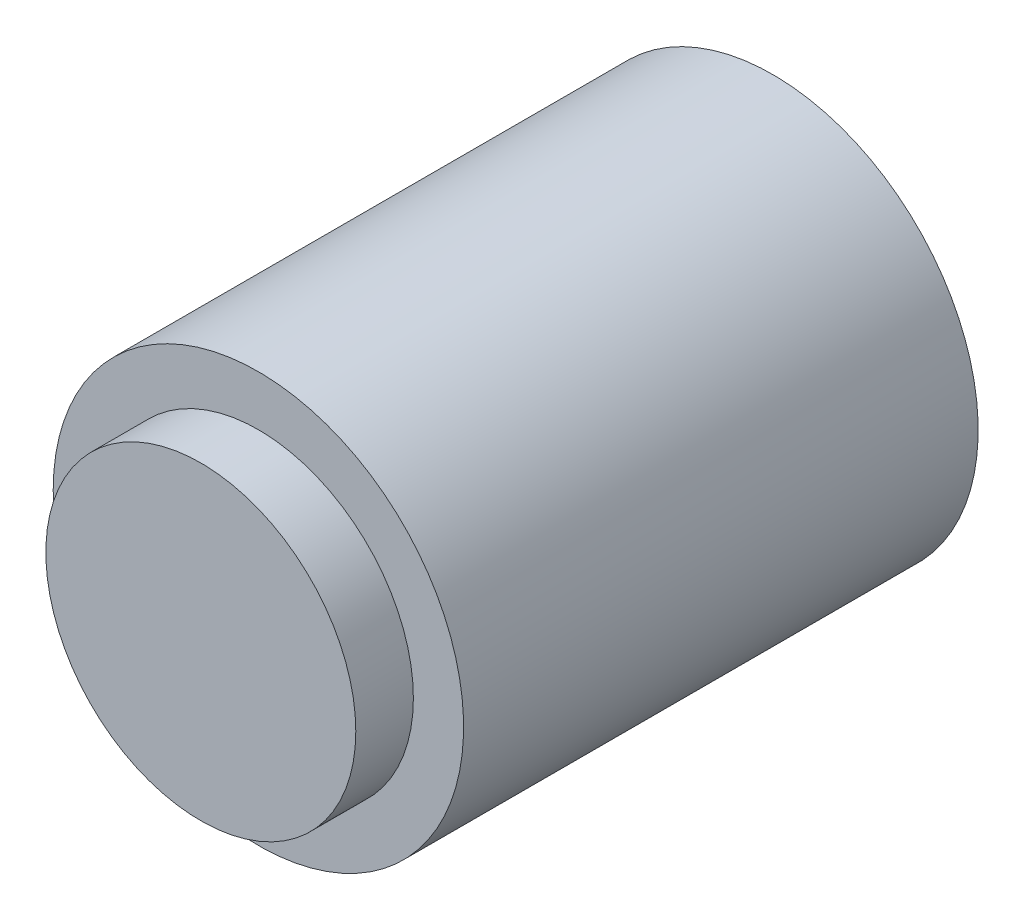
ISO-10303-21;
HEADER;
FILE_DESCRIPTION(('STEP AP214'),'2;1');
FILE_NAME('part.step','',(''),(''),'','','');
FILE_SCHEMA(('AUTOMOTIVE_DESIGN { 1 0 10303 214 1 1 1 1 }'));
ENDSEC;
DATA;
#1=APPLICATION_CONTEXT('core data for automotive mechanical design processes');
#2=APPLICATION_PROTOCOL_DEFINITION('international standard','automotive_design',2000,#1);
#3=PRODUCT_CONTEXT('',#1,'mechanical');
#4=PRODUCT('Part','Part','',(#3));
#5=PRODUCT_RELATED_PRODUCT_CATEGORY('part','',(#4));
#6=PRODUCT_DEFINITION_FORMATION('','',#4);
#7=PRODUCT_DEFINITION_CONTEXT('part definition',#1,'design');
#8=PRODUCT_DEFINITION('design','',#6,#7);
#9=PRODUCT_DEFINITION_SHAPE('','',#8);
#10=(LENGTH_UNIT() NAMED_UNIT(*) SI_UNIT(.MILLI.,.METRE.));
#11=(NAMED_UNIT(*) PLANE_ANGLE_UNIT() SI_UNIT($,.RADIAN.));
#12=(NAMED_UNIT(*) SI_UNIT($,.STERADIAN.) SOLID_ANGLE_UNIT());
#13=UNCERTAINTY_MEASURE_WITH_UNIT(LENGTH_MEASURE(1.E-05),#10,'distance_accuracy_value','');
#14=(GEOMETRIC_REPRESENTATION_CONTEXT(3) GLOBAL_UNCERTAINTY_ASSIGNED_CONTEXT((#13)) GLOBAL_UNIT_ASSIGNED_CONTEXT((#10,
#11,#12)) REPRESENTATION_CONTEXT('',''));
#15=CARTESIAN_POINT('',(0.,0.,0.));
#16=DIRECTION('',(0.,0.,1.));
#17=DIRECTION('',(1.,0.,0.));
#18=AXIS2_PLACEMENT_3D('',#15,#16,#17);
#19=CARTESIAN_POINT('',(0.,0.,42.));
#20=DIRECTION('',(0.,0.,-1.));
#21=DIRECTION('',(-1.,0.,0.));
#22=AXIS2_PLACEMENT_3D('',#19,#20,#21);
#23=CYLINDRICAL_SURFACE('',#22,16.75);
#24=CARTESIAN_POINT('',(0.,0.,42.));
#25=DIRECTION('',(0.,0.,1.));
#26=DIRECTION('',(1.,0.,0.));
#27=AXIS2_PLACEMENT_3D('',#24,#25,#26);
#28=CIRCLE('',#27,16.75);
#29=CARTESIAN_POINT('',(-16.75,0.,42.));
#30=VERTEX_POINT('',#29);
#31=EDGE_CURVE('E43',#30,#30,#28,.T.);
#32=CARTESIAN_POINT('',(0.,0.,0.));
#33=DIRECTION('',(0.,0.,1.));
#34=DIRECTION('',(1.,0.,0.));
#35=AXIS2_PLACEMENT_3D('',#32,#33,#34);
#36=CIRCLE('',#35,16.75);
#37=CARTESIAN_POINT('',(-16.75,0.,0.));
#38=VERTEX_POINT('',#37);
#39=EDGE_CURVE('E39',#38,#38,#36,.T.);
#40=CARTESIAN_POINT('',(-16.75,0.,42.));
#41=CARTESIAN_POINT('',(-16.75,0.,41.5625));
#42=CARTESIAN_POINT('',(-16.75,0.,41.125));
#43=CARTESIAN_POINT('',(-16.75,0.,40.25));
#44=CARTESIAN_POINT('',(-16.75,0.,39.8125));
#45=CARTESIAN_POINT('',(-16.75,0.,38.9375));
#46=CARTESIAN_POINT('',(-16.75,0.,38.5));
#47=CARTESIAN_POINT('',(-16.75,0.,37.625));
#48=CARTESIAN_POINT('',(-16.75,0.,37.1875));
#49=CARTESIAN_POINT('',(-16.75,0.,36.3125));
#50=CARTESIAN_POINT('',(-16.75,0.,35.875));
#51=CARTESIAN_POINT('',(-16.75,0.,35.));
#52=CARTESIAN_POINT('',(-16.75,0.,34.5625));
#53=CARTESIAN_POINT('',(-16.75,0.,33.6875));
#54=CARTESIAN_POINT('',(-16.75,0.,33.25));
#55=CARTESIAN_POINT('',(-16.75,0.,32.375));
#56=CARTESIAN_POINT('',(-16.75,0.,31.9375));
#57=CARTESIAN_POINT('',(-16.75,0.,31.0625));
#58=CARTESIAN_POINT('',(-16.75,0.,30.625));
#59=CARTESIAN_POINT('',(-16.75,0.,29.75));
#60=CARTESIAN_POINT('',(-16.75,0.,29.3125));
#61=CARTESIAN_POINT('',(-16.75,0.,28.4375));
#62=CARTESIAN_POINT('',(-16.75,0.,28.));
#63=CARTESIAN_POINT('',(-16.75,0.,27.125));
#64=CARTESIAN_POINT('',(-16.75,0.,26.6875));
#65=CARTESIAN_POINT('',(-16.75,0.,25.8125));
#66=CARTESIAN_POINT('',(-16.75,0.,25.375));
#67=CARTESIAN_POINT('',(-16.75,0.,24.5));
#68=CARTESIAN_POINT('',(-16.75,0.,24.0625));
#69=CARTESIAN_POINT('',(-16.75,0.,23.1875));
#70=CARTESIAN_POINT('',(-16.75,0.,22.75));
#71=CARTESIAN_POINT('',(-16.75,0.,21.875));
#72=CARTESIAN_POINT('',(-16.75,0.,21.4375));
#73=CARTESIAN_POINT('',(-16.75,0.,20.5625));
#74=CARTESIAN_POINT('',(-16.75,0.,20.125));
#75=CARTESIAN_POINT('',(-16.75,0.,19.25));
#76=CARTESIAN_POINT('',(-16.75,0.,18.8125));
#77=CARTESIAN_POINT('',(-16.75,0.,17.9375));
#78=CARTESIAN_POINT('',(-16.75,0.,17.5));
#79=CARTESIAN_POINT('',(-16.75,0.,16.625));
#80=CARTESIAN_POINT('',(-16.75,0.,16.1875));
#81=CARTESIAN_POINT('',(-16.75,0.,15.3125));
#82=CARTESIAN_POINT('',(-16.75,0.,14.875));
#83=CARTESIAN_POINT('',(-16.75,0.,14.));
#84=CARTESIAN_POINT('',(-16.75,0.,13.5625));
#85=CARTESIAN_POINT('',(-16.75,0.,12.6875));
#86=CARTESIAN_POINT('',(-16.75,0.,12.25));
#87=CARTESIAN_POINT('',(-16.75,0.,11.375));
#88=CARTESIAN_POINT('',(-16.75,0.,10.9375));
#89=CARTESIAN_POINT('',(-16.75,0.,10.0625));
#90=CARTESIAN_POINT('',(-16.75,0.,9.625));
#91=CARTESIAN_POINT('',(-16.75,0.,8.75));
#92=CARTESIAN_POINT('',(-16.75,0.,8.3125));
#93=CARTESIAN_POINT('',(-16.75,0.,7.4375));
#94=CARTESIAN_POINT('',(-16.75,0.,7.));
#95=CARTESIAN_POINT('',(-16.75,0.,6.125));
#96=CARTESIAN_POINT('',(-16.75,0.,5.6875));
#97=CARTESIAN_POINT('',(-16.75,0.,4.8125));
#98=CARTESIAN_POINT('',(-16.75,0.,4.375));
#99=CARTESIAN_POINT('',(-16.75,0.,3.5));
#100=CARTESIAN_POINT('',(-16.75,0.,3.0625));
#101=CARTESIAN_POINT('',(-16.75,0.,2.1875));
#102=CARTESIAN_POINT('',(-16.75,0.,1.75));
#103=CARTESIAN_POINT('',(-16.75,0.,0.875000000000001));
#104=CARTESIAN_POINT('',(-16.75,0.,0.4375));
#105=CARTESIAN_POINT('',(-16.75,0.,0.));
#106=B_SPLINE_CURVE_WITH_KNOTS('',3,(#40,#41,#42,#43,#44,#45,#46,#47,#48,#49,#50,#51,#52,#53,
#54,#55,#56,#57,#58,#59,#60,#61,#62,#63,#64,#65,#66,#67,#68,#69,#70,#71,#72,#73,#74,#75,#76,#77,
#78,#79,#80,#81,#82,#83,#84,#85,#86,#87,#88,#89,#90,#91,#92,#93,#94,#95,#96,#97,#98,#99,#100,
#101,#102,#103,#104,#105),.UNSPECIFIED.,.F.,.F.,(4,2,2,2,2,2,2,2,2,2,2,2,2,2,2,2,2,2,2,2,2,2,2,
2,2,2,2,2,2,2,2,2,4),(0.,1.3125,2.625,3.9375,5.25,6.56250000000001,7.875,9.1875,10.5,11.8125,
13.125,14.4375,15.75,17.0625,18.375,19.6875,21.,22.3125,23.625,24.9375,26.25,27.5625,28.875,
30.1875,31.5,32.8125,34.125,35.4375,36.75,38.0625,39.375,40.6875,42.),.UNSPECIFIED.);
#107=EDGE_CURVE('BSEAM36',#30,#38,#106,.T.);
#108=ORIENTED_EDGE('',*,*,#31,.F.);
#109=ORIENTED_EDGE('',*,*,#39,.T.);
#110=ORIENTED_EDGE('',*,*,#107,.T.);
#111=ORIENTED_EDGE('',*,*,#107,.F.);
#112=EDGE_LOOP('',(#108,#110,#109,#111));
#113=FACE_BOUND('',#112,.T.);
#114=ADVANCED_FACE('F36',(#113),#23,.T.);
#115=CARTESIAN_POINT('',(0.,0.,42.));
#116=DIRECTION('',(0.,0.,1.));
#117=DIRECTION('',(1.,0.,0.));
#118=AXIS2_PLACEMENT_3D('',#115,#116,#117);
#119=PLANE('',#118);
#120=CARTESIAN_POINT('',(0.,0.,42.));
#121=DIRECTION('',(0.,0.,1.));
#122=DIRECTION('',(1.,0.,0.));
#123=AXIS2_PLACEMENT_3D('',#120,#121,#122);
#124=CIRCLE('',#123,12.65);
#125=CARTESIAN_POINT('',(12.65,0.,42.));
#126=VERTEX_POINT('',#125);
#127=EDGE_CURVE('E10',#126,#126,#124,.T.);
#128=ORIENTED_EDGE('',*,*,#127,.F.);
#129=EDGE_LOOP('',(#128));
#130=FACE_BOUND('',#129,.T.);
#131=ORIENTED_EDGE('',*,*,#31,.T.);
#132=EDGE_LOOP('',(#131));
#133=FACE_BOUND('',#132,.T.);
#134=ADVANCED_FACE('F72',(#130,#133),#119,.T.);
#135=CARTESIAN_POINT('',(0.,0.,0.));
#136=DIRECTION('',(0.,0.,1.));
#137=DIRECTION('',(1.,0.,0.));
#138=AXIS2_PLACEMENT_3D('',#135,#136,#137);
#139=PLANE('',#138);
#140=CARTESIAN_POINT('',(0.,0.,0.));
#141=DIRECTION('',(0.,0.,-1.));
#142=DIRECTION('',(-1.,0.,0.));
#143=AXIS2_PLACEMENT_3D('',#140,#141,#142);
#144=CIRCLE('',#143,15.5);
#145=CARTESIAN_POINT('',(-15.5,0.,0.));
#146=VERTEX_POINT('',#145);
#147=EDGE_CURVE('E53',#146,#146,#144,.T.);
#148=ORIENTED_EDGE('',*,*,#147,.F.);
#149=EDGE_LOOP('',(#148));
#150=FACE_BOUND('',#149,.T.);
#151=ORIENTED_EDGE('',*,*,#39,.F.);
#152=EDGE_LOOP('',(#151));
#153=FACE_BOUND('',#152,.T.);
#154=ADVANCED_FACE('F68',(#150,#153),#139,.F.);
#155=CARTESIAN_POINT('',(0.,0.,46.7));
#156=DIRECTION('',(0.,0.,-1.));
#157=DIRECTION('',(-1.,0.,0.));
#158=AXIS2_PLACEMENT_3D('',#155,#156,#157);
#159=CYLINDRICAL_SURFACE('',#158,12.65);
#160=CARTESIAN_POINT('',(0.,0.,46.7));
#161=DIRECTION('',(0.,0.,1.));
#162=DIRECTION('',(1.,0.,0.));
#163=AXIS2_PLACEMENT_3D('',#160,#161,#162);
#164=CIRCLE('',#163,12.65);
#165=CARTESIAN_POINT('',(12.65,0.,46.7));
#166=VERTEX_POINT('',#165);
#167=EDGE_CURVE('E49',#166,#166,#164,.T.);
#168=ORIENTED_EDGE('',*,*,#167,.F.);
#169=EDGE_LOOP('',(#168));
#170=FACE_BOUND('',#169,.T.);
#171=ORIENTED_EDGE('',*,*,#127,.T.);
#172=EDGE_LOOP('',(#171));
#173=FACE_BOUND('',#172,.T.);
#174=ADVANCED_FACE('F71',(#170,#173),#159,.T.);
#175=CARTESIAN_POINT('',(0.,0.,46.7));
#176=DIRECTION('',(0.,0.,1.));
#177=DIRECTION('',(1.,0.,0.));
#178=AXIS2_PLACEMENT_3D('',#175,#176,#177);
#179=PLANE('',#178);
#180=ORIENTED_EDGE('',*,*,#167,.T.);
#181=EDGE_LOOP('',(#180));
#182=FACE_BOUND('',#181,.T.);
#183=ADVANCED_FACE('F64',(#182),#179,.T.);
#184=CARTESIAN_POINT('',(0.,0.,4.7));
#185=DIRECTION('',(0.,0.,-1.));
#186=DIRECTION('',(-1.,0.,0.));
#187=AXIS2_PLACEMENT_3D('',#184,#185,#186);
#188=CYLINDRICAL_SURFACE('',#187,15.5);
#189=CARTESIAN_POINT('',(0.,0.,4.7));
#190=DIRECTION('',(0.,0.,-1.));
#191=DIRECTION('',(-1.,0.,0.));
#192=AXIS2_PLACEMENT_3D('',#189,#190,#191);
#193=CIRCLE('',#192,15.5);
#194=CARTESIAN_POINT('',(-15.5,0.,4.7));
#195=VERTEX_POINT('',#194);
#196=EDGE_CURVE('E52',#195,#195,#193,.T.);
#197=ORIENTED_EDGE('',*,*,#196,.F.);
#198=EDGE_LOOP('',(#197));
#199=FACE_BOUND('',#198,.T.);
#200=ORIENTED_EDGE('',*,*,#147,.T.);
#201=EDGE_LOOP('',(#200));
#202=FACE_BOUND('',#201,.T.);
#203=ADVANCED_FACE('F61',(#199,#202),#188,.F.);
#204=CARTESIAN_POINT('',(0.,0.,4.7));
#205=DIRECTION('',(0.,0.,-1.));
#206=DIRECTION('',(-1.,0.,0.));
#207=AXIS2_PLACEMENT_3D('',#204,#205,#206);
#208=PLANE('',#207);
#209=ORIENTED_EDGE('',*,*,#196,.T.);
#210=EDGE_LOOP('',(#209));
#211=FACE_BOUND('',#210,.T.);
#212=ADVANCED_FACE('F59',(#211),#208,.T.);
#213=CLOSED_SHELL('',(#114,#134,#154,#174,#183,#203,#212));
#214=MANIFOLD_SOLID_BREP('B2',#213);
#215=ADVANCED_BREP_SHAPE_REPRESENTATION('',(#18,#214),#14);
#216=SHAPE_DEFINITION_REPRESENTATION(#9,#215);
ENDSEC;
END-ISO-10303-21;
